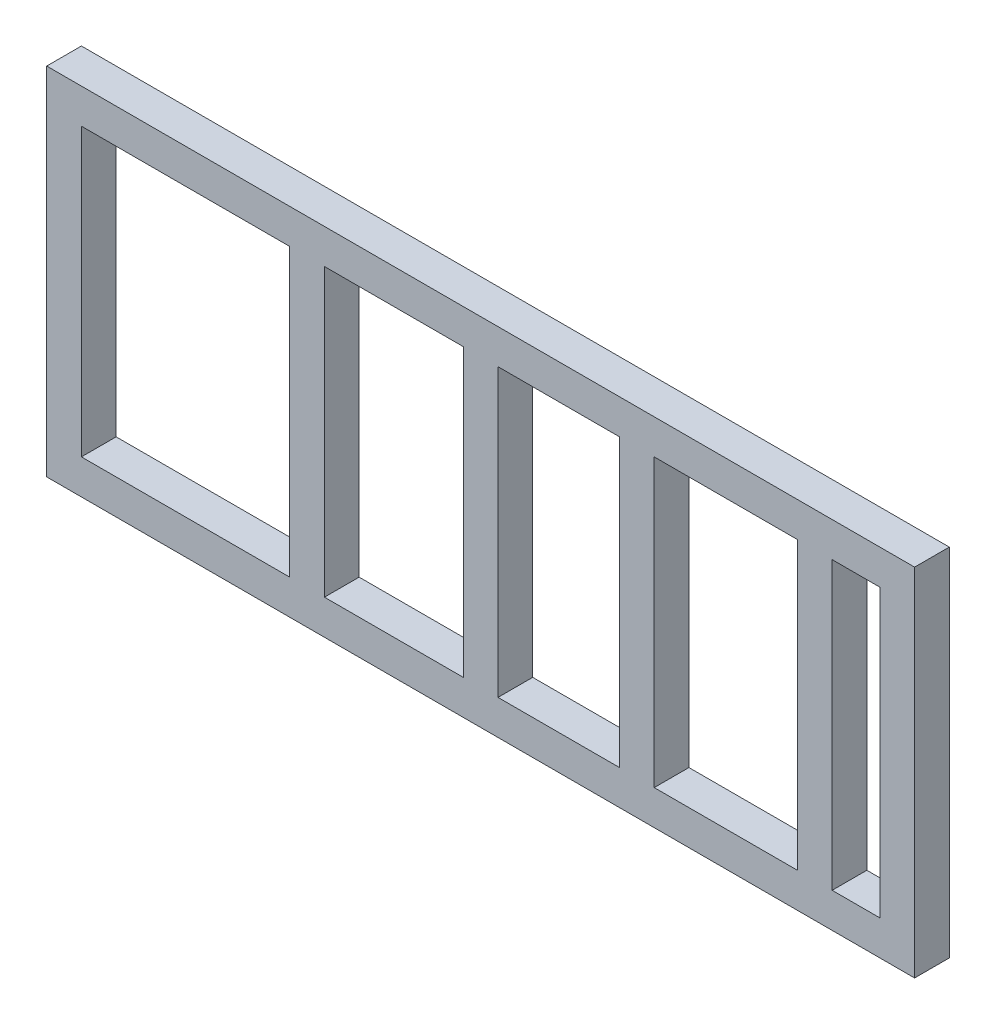
ISO-10303-21;
HEADER;
FILE_DESCRIPTION(('STEP AP214'),'2;1');
FILE_NAME('part.step','',(''),(''),'','','');
FILE_SCHEMA(('AUTOMOTIVE_DESIGN { 1 0 10303 214 1 1 1 1 }'));
ENDSEC;
DATA;
#1=APPLICATION_CONTEXT('core data for automotive mechanical design processes');
#2=APPLICATION_PROTOCOL_DEFINITION('international standard','automotive_design',2000,#1);
#3=PRODUCT_CONTEXT('',#1,'mechanical');
#4=PRODUCT('Part','Part','',(#3));
#5=PRODUCT_RELATED_PRODUCT_CATEGORY('part','',(#4));
#6=PRODUCT_DEFINITION_FORMATION('','',#4);
#7=PRODUCT_DEFINITION_CONTEXT('part definition',#1,'design');
#8=PRODUCT_DEFINITION('design','',#6,#7);
#9=PRODUCT_DEFINITION_SHAPE('','',#8);
#10=(LENGTH_UNIT() NAMED_UNIT(*) SI_UNIT(.MILLI.,.METRE.));
#11=(NAMED_UNIT(*) PLANE_ANGLE_UNIT() SI_UNIT($,.RADIAN.));
#12=(NAMED_UNIT(*) SI_UNIT($,.STERADIAN.) SOLID_ANGLE_UNIT());
#13=UNCERTAINTY_MEASURE_WITH_UNIT(LENGTH_MEASURE(1.E-05),#10,'distance_accuracy_value','');
#14=(GEOMETRIC_REPRESENTATION_CONTEXT(3) GLOBAL_UNCERTAINTY_ASSIGNED_CONTEXT((#13)) GLOBAL_UNIT_ASSIGNED_CONTEXT((#10,
#11,#12)) REPRESENTATION_CONTEXT('',''));
#15=CARTESIAN_POINT('',(0.,0.,0.));
#16=DIRECTION('',(0.,0.,1.));
#17=DIRECTION('',(1.,0.,0.));
#18=AXIS2_PLACEMENT_3D('',#15,#16,#17);
#19=CARTESIAN_POINT('',(405.,-165.,-45.));
#20=DIRECTION('',(1.,0.,0.));
#21=DIRECTION('',(0.,1.,0.));
#22=AXIS2_PLACEMENT_3D('',#19,#20,#21);
#23=PLANE('',#22);
#24=DIRECTION('',(0.,0.,1.));
#25=VECTOR('',#24,1.);
#26=CARTESIAN_POINT('',(405.,-165.,-45.));
#27=LINE('',#26,#25);
#28=CARTESIAN_POINT('',(405.,-165.,-45.));
#29=VERTEX_POINT('',#28);
#30=CARTESIAN_POINT('',(405.,-165.,-5.));
#31=VERTEX_POINT('',#30);
#32=EDGE_CURVE('E464',#29,#31,#27,.T.);
#33=ORIENTED_EDGE('',*,*,#32,.F.);
#34=DIRECTION('',(0.,1.,0.));
#35=VECTOR('',#34,1.);
#36=CARTESIAN_POINT('',(405.,-165.,-45.));
#37=LINE('',#36,#35);
#38=CARTESIAN_POINT('',(405.,165.,-45.));
#39=VERTEX_POINT('',#38);
#40=EDGE_CURVE('E303',#29,#39,#37,.T.);
#41=ORIENTED_EDGE('',*,*,#40,.T.);
#42=DIRECTION('',(0.,0.,1.));
#43=VECTOR('',#42,1.);
#44=CARTESIAN_POINT('',(405.,165.,-45.));
#45=LINE('',#44,#43);
#46=CARTESIAN_POINT('',(405.,165.,-5.));
#47=VERTEX_POINT('',#46);
#48=EDGE_CURVE('E429',#39,#47,#45,.T.);
#49=ORIENTED_EDGE('',*,*,#48,.T.);
#50=DIRECTION('',(0.,1.,0.));
#51=VECTOR('',#50,1.);
#52=CARTESIAN_POINT('',(405.,-165.,-5.));
#53=LINE('',#52,#51);
#54=EDGE_CURVE('E309',#31,#47,#53,.T.);
#55=ORIENTED_EDGE('',*,*,#54,.F.);
#56=EDGE_LOOP('',(#33,#41,#49,#55));
#57=FACE_BOUND('',#56,.T.);
#58=ADVANCED_FACE('F15',(#57),#23,.T.);
#59=CARTESIAN_POINT('',(365.,-165.,-45.));
#60=DIRECTION('',(1.,0.,0.));
#61=DIRECTION('',(0.,1.,0.));
#62=AXIS2_PLACEMENT_3D('',#59,#60,#61);
#63=PLANE('',#62);
#64=DIRECTION('',(0.,1.,0.));
#65=VECTOR('',#64,1.);
#66=CARTESIAN_POINT('',(365.,-165.,-5.));
#67=LINE('',#66,#65);
#68=CARTESIAN_POINT('',(365.,-165.,-5.));
#69=VERTEX_POINT('',#68);
#70=CARTESIAN_POINT('',(365.,165.,-5.));
#71=VERTEX_POINT('',#70);
#72=EDGE_CURVE('E274',#69,#71,#67,.T.);
#73=ORIENTED_EDGE('',*,*,#72,.T.);
#74=DIRECTION('',(0.,0.,1.));
#75=VECTOR('',#74,1.);
#76=CARTESIAN_POINT('',(365.,165.,-45.));
#77=LINE('',#76,#75);
#78=CARTESIAN_POINT('',(365.,165.,-45.));
#79=VERTEX_POINT('',#78);
#80=EDGE_CURVE('E433',#79,#71,#77,.T.);
#81=ORIENTED_EDGE('',*,*,#80,.F.);
#82=DIRECTION('',(0.,1.,0.));
#83=VECTOR('',#82,1.);
#84=CARTESIAN_POINT('',(365.,-165.,-45.));
#85=LINE('',#84,#83);
#86=CARTESIAN_POINT('',(365.,-165.,-45.));
#87=VERTEX_POINT('',#86);
#88=EDGE_CURVE('E427',#87,#79,#85,.T.);
#89=ORIENTED_EDGE('',*,*,#88,.F.);
#90=DIRECTION('',(0.,0.,1.));
#91=VECTOR('',#90,1.);
#92=CARTESIAN_POINT('',(365.,-165.,-45.));
#93=LINE('',#92,#91);
#94=EDGE_CURVE('E292',#87,#69,#93,.T.);
#95=ORIENTED_EDGE('',*,*,#94,.T.);
#96=EDGE_LOOP('',(#73,#81,#89,#95));
#97=FACE_BOUND('',#96,.T.);
#98=ADVANCED_FACE('F532',(#97),#63,.F.);
#99=CARTESIAN_POINT('',(-220.,-165.,-45.));
#100=DIRECTION('',(1.,0.,0.));
#101=DIRECTION('',(0.,1.,0.));
#102=AXIS2_PLACEMENT_3D('',#99,#100,#101);
#103=PLANE('',#102);
#104=DIRECTION('',(0.,1.,0.));
#105=VECTOR('',#104,1.);
#106=CARTESIAN_POINT('',(-220.,-165.,-5.));
#107=LINE('',#106,#105);
#108=CARTESIAN_POINT('',(-220.,-165.,-5.));
#109=VERTEX_POINT('',#108);
#110=CARTESIAN_POINT('',(-220.,165.,-5.));
#111=VERTEX_POINT('',#110);
#112=EDGE_CURVE('E239',#109,#111,#107,.T.);
#113=ORIENTED_EDGE('',*,*,#112,.T.);
#114=DIRECTION('',(0.,0.,1.));
#115=VECTOR('',#114,1.);
#116=CARTESIAN_POINT('',(-220.,165.,-45.));
#117=LINE('',#116,#115);
#118=CARTESIAN_POINT('',(-220.,165.,-45.));
#119=VERTEX_POINT('',#118);
#120=EDGE_CURVE('E9',#119,#111,#117,.T.);
#121=ORIENTED_EDGE('',*,*,#120,.F.);
#122=DIRECTION('',(0.,1.,0.));
#123=VECTOR('',#122,1.);
#124=CARTESIAN_POINT('',(-220.,-165.,-45.));
#125=LINE('',#124,#123);
#126=CARTESIAN_POINT('',(-220.,-165.,-45.));
#127=VERTEX_POINT('',#126);
#128=EDGE_CURVE('E414',#127,#119,#125,.T.);
#129=ORIENTED_EDGE('',*,*,#128,.F.);
#130=DIRECTION('',(0.,0.,1.));
#131=VECTOR('',#130,1.);
#132=CARTESIAN_POINT('',(-220.,-165.,-45.));
#133=LINE('',#132,#131);
#134=EDGE_CURVE('E489',#127,#109,#133,.T.);
#135=ORIENTED_EDGE('',*,*,#134,.T.);
#136=EDGE_LOOP('',(#113,#121,#129,#135));
#137=FACE_BOUND('',#136,.T.);
#138=ADVANCED_FACE('F539',(#137),#103,.F.);
#139=CARTESIAN_POINT('',(-460.,165.,-45.));
#140=DIRECTION('',(0.,1.,0.));
#141=DIRECTION('',(1.,0.,0.));
#142=AXIS2_PLACEMENT_3D('',#139,#140,#141);
#143=PLANE('',#142);
#144=ORIENTED_EDGE('',*,*,#120,.T.);
#145=DIRECTION('',(1.,0.,0.));
#146=VECTOR('',#145,1.);
#147=CARTESIAN_POINT('',(-460.,165.,-5.));
#148=LINE('',#147,#146);
#149=CARTESIAN_POINT('',(-460.,165.,-5.));
#150=VERTEX_POINT('',#149);
#151=EDGE_CURVE('E374',#150,#111,#148,.T.);
#152=ORIENTED_EDGE('',*,*,#151,.F.);
#153=DIRECTION('',(0.,0.,1.));
#154=VECTOR('',#153,1.);
#155=CARTESIAN_POINT('',(-460.,165.,-45.));
#156=LINE('',#155,#154);
#157=CARTESIAN_POINT('',(-460.,165.,-45.));
#158=VERTEX_POINT('',#157);
#159=EDGE_CURVE('E23',#158,#150,#156,.T.);
#160=ORIENTED_EDGE('',*,*,#159,.F.);
#161=DIRECTION('',(1.,0.,0.));
#162=VECTOR('',#161,1.);
#163=CARTESIAN_POINT('',(-460.,165.,-45.));
#164=LINE('',#163,#162);
#165=EDGE_CURVE('E460',#158,#119,#164,.T.);
#166=ORIENTED_EDGE('',*,*,#165,.T.);
#167=EDGE_LOOP('',(#144,#152,#160,#166));
#168=FACE_BOUND('',#167,.T.);
#169=ADVANCED_FACE('F499',(#168),#143,.F.);
#170=CARTESIAN_POINT('',(-460.,-205.,-45.));
#171=DIRECTION('',(1.,0.,0.));
#172=DIRECTION('',(0.,1.,0.));
#173=AXIS2_PLACEMENT_3D('',#170,#171,#172);
#174=PLANE('',#173);
#175=DIRECTION('',(0.,1.,0.));
#176=VECTOR('',#175,1.);
#177=CARTESIAN_POINT('',(-460.,-205.,-5.));
#178=LINE('',#177,#176);
#179=CARTESIAN_POINT('',(-460.,-165.,-5.));
#180=VERTEX_POINT('',#179);
#181=EDGE_CURVE('E377',#180,#150,#178,.T.);
#182=ORIENTED_EDGE('',*,*,#181,.F.);
#183=DIRECTION('',(0.,0.,1.));
#184=VECTOR('',#183,1.);
#185=CARTESIAN_POINT('',(-460.,-165.,-45.));
#186=LINE('',#185,#184);
#187=CARTESIAN_POINT('',(-460.,-165.,-45.));
#188=VERTEX_POINT('',#187);
#189=EDGE_CURVE('E34',#188,#180,#186,.T.);
#190=ORIENTED_EDGE('',*,*,#189,.F.);
#191=DIRECTION('',(0.,1.,0.));
#192=VECTOR('',#191,1.);
#193=CARTESIAN_POINT('',(-460.,-205.,-45.));
#194=LINE('',#193,#192);
#195=EDGE_CURVE('E422',#188,#158,#194,.T.);
#196=ORIENTED_EDGE('',*,*,#195,.T.);
#197=ORIENTED_EDGE('',*,*,#159,.T.);
#198=EDGE_LOOP('',(#182,#190,#196,#197));
#199=FACE_BOUND('',#198,.T.);
#200=ADVANCED_FACE('F493',(#199),#174,.T.);
#201=CARTESIAN_POINT('',(-460.,-165.,-45.));
#202=DIRECTION('',(0.,1.,0.));
#203=DIRECTION('',(1.,0.,0.));
#204=AXIS2_PLACEMENT_3D('',#201,#202,#203);
#205=PLANE('',#204);
#206=DIRECTION('',(1.,0.,0.));
#207=VECTOR('',#206,1.);
#208=CARTESIAN_POINT('',(-460.,-165.,-45.));
#209=LINE('',#208,#207);
#210=EDGE_CURVE('E423',#188,#127,#209,.T.);
#211=ORIENTED_EDGE('',*,*,#210,.F.);
#212=ORIENTED_EDGE('',*,*,#189,.T.);
#213=DIRECTION('',(1.,0.,0.));
#214=VECTOR('',#213,1.);
#215=CARTESIAN_POINT('',(-460.,-165.,-5.));
#216=LINE('',#215,#214);
#217=EDGE_CURVE('E382',#180,#109,#216,.T.);
#218=ORIENTED_EDGE('',*,*,#217,.T.);
#219=ORIENTED_EDGE('',*,*,#134,.F.);
#220=EDGE_LOOP('',(#211,#212,#218,#219));
#221=FACE_BOUND('',#220,.T.);
#222=ADVANCED_FACE('F504',(#221),#205,.T.);
#223=CARTESIAN_POINT('',(-20.,-165.,-45.));
#224=DIRECTION('',(1.,0.,0.));
#225=DIRECTION('',(0.,1.,0.));
#226=AXIS2_PLACEMENT_3D('',#223,#224,#225);
#227=PLANE('',#226);
#228=DIRECTION('',(0.,1.,0.));
#229=VECTOR('',#228,1.);
#230=CARTESIAN_POINT('',(-20.,-165.,-5.));
#231=LINE('',#230,#229);
#232=CARTESIAN_POINT('',(-20.,-165.,-5.));
#233=VERTEX_POINT('',#232);
#234=CARTESIAN_POINT('',(-20.,165.,-5.));
#235=VERTEX_POINT('',#234);
#236=EDGE_CURVE('E372',#233,#235,#231,.T.);
#237=ORIENTED_EDGE('',*,*,#236,.T.);
#238=DIRECTION('',(0.,0.,1.));
#239=VECTOR('',#238,1.);
#240=CARTESIAN_POINT('',(-20.,165.,-45.));
#241=LINE('',#240,#239);
#242=CARTESIAN_POINT('',(-20.,165.,-45.));
#243=VERTEX_POINT('',#242);
#244=EDGE_CURVE('E332',#243,#235,#241,.T.);
#245=ORIENTED_EDGE('',*,*,#244,.F.);
#246=DIRECTION('',(0.,1.,0.));
#247=VECTOR('',#246,1.);
#248=CARTESIAN_POINT('',(-20.,-165.,-45.));
#249=LINE('',#248,#247);
#250=CARTESIAN_POINT('',(-20.,-165.,-45.));
#251=VERTEX_POINT('',#250);
#252=EDGE_CURVE('E396',#251,#243,#249,.T.);
#253=ORIENTED_EDGE('',*,*,#252,.F.);
#254=DIRECTION('',(0.,0.,1.));
#255=VECTOR('',#254,1.);
#256=CARTESIAN_POINT('',(-20.,-165.,-45.));
#257=LINE('',#256,#255);
#258=EDGE_CURVE('E483',#251,#233,#257,.T.);
#259=ORIENTED_EDGE('',*,*,#258,.T.);
#260=EDGE_LOOP('',(#237,#245,#253,#259));
#261=FACE_BOUND('',#260,.T.);
#262=ADVANCED_FACE('F598',(#261),#227,.F.);
#263=CARTESIAN_POINT('',(-460.,165.,-45.));
#264=DIRECTION('',(0.,1.,0.));
#265=DIRECTION('',(1.,0.,0.));
#266=AXIS2_PLACEMENT_3D('',#263,#264,#265);
#267=PLANE('',#266);
#268=ORIENTED_EDGE('',*,*,#244,.T.);
#269=DIRECTION('',(1.,0.,0.));
#270=VECTOR('',#269,1.);
#271=CARTESIAN_POINT('',(-460.,165.,-5.));
#272=LINE('',#271,#270);
#273=CARTESIAN_POINT('',(-180.,165.,-5.));
#274=VERTEX_POINT('',#273);
#275=EDGE_CURVE('E367',#274,#235,#272,.T.);
#276=ORIENTED_EDGE('',*,*,#275,.F.);
#277=DIRECTION('',(0.,0.,1.));
#278=VECTOR('',#277,1.);
#279=CARTESIAN_POINT('',(-180.,165.,-45.));
#280=LINE('',#279,#278);
#281=CARTESIAN_POINT('',(-180.,165.,-45.));
#282=VERTEX_POINT('',#281);
#283=EDGE_CURVE('E331',#282,#274,#280,.T.);
#284=ORIENTED_EDGE('',*,*,#283,.F.);
#285=DIRECTION('',(1.,0.,0.));
#286=VECTOR('',#285,1.);
#287=CARTESIAN_POINT('',(-460.,165.,-45.));
#288=LINE('',#287,#286);
#289=EDGE_CURVE('E397',#282,#243,#288,.T.);
#290=ORIENTED_EDGE('',*,*,#289,.T.);
#291=EDGE_LOOP('',(#268,#276,#284,#290));
#292=FACE_BOUND('',#291,.T.);
#293=ADVANCED_FACE('F592',(#292),#267,.F.);
#294=CARTESIAN_POINT('',(-180.,-165.,-45.));
#295=DIRECTION('',(1.,0.,0.));
#296=DIRECTION('',(0.,1.,0.));
#297=AXIS2_PLACEMENT_3D('',#294,#295,#296);
#298=PLANE('',#297);
#299=DIRECTION('',(0.,0.,1.));
#300=VECTOR('',#299,1.);
#301=CARTESIAN_POINT('',(-180.,-165.,-45.));
#302=LINE('',#301,#300);
#303=CARTESIAN_POINT('',(-180.,-165.,-45.));
#304=VERTEX_POINT('',#303);
#305=CARTESIAN_POINT('',(-180.,-165.,-5.));
#306=VERTEX_POINT('',#305);
#307=EDGE_CURVE('E477',#304,#306,#302,.T.);
#308=ORIENTED_EDGE('',*,*,#307,.F.);
#309=DIRECTION('',(0.,1.,0.));
#310=VECTOR('',#309,1.);
#311=CARTESIAN_POINT('',(-180.,-165.,-45.));
#312=LINE('',#311,#310);
#313=EDGE_CURVE('E418',#304,#282,#312,.T.);
#314=ORIENTED_EDGE('',*,*,#313,.T.);
#315=ORIENTED_EDGE('',*,*,#283,.T.);
#316=DIRECTION('',(0.,1.,0.));
#317=VECTOR('',#316,1.);
#318=CARTESIAN_POINT('',(-180.,-165.,-5.));
#319=LINE('',#318,#317);
#320=EDGE_CURVE('E368',#306,#274,#319,.T.);
#321=ORIENTED_EDGE('',*,*,#320,.F.);
#322=EDGE_LOOP('',(#308,#314,#315,#321));
#323=FACE_BOUND('',#322,.T.);
#324=ADVANCED_FACE('F587',(#323),#298,.T.);
#325=CARTESIAN_POINT('',(-460.,-165.,-45.));
#326=DIRECTION('',(0.,1.,0.));
#327=DIRECTION('',(1.,0.,0.));
#328=AXIS2_PLACEMENT_3D('',#325,#326,#327);
#329=PLANE('',#328);
#330=DIRECTION('',(1.,0.,0.));
#331=VECTOR('',#330,1.);
#332=CARTESIAN_POINT('',(-460.,-165.,-45.));
#333=LINE('',#332,#331);
#334=EDGE_CURVE('E411',#304,#251,#333,.T.);
#335=ORIENTED_EDGE('',*,*,#334,.F.);
#336=ORIENTED_EDGE('',*,*,#307,.T.);
#337=DIRECTION('',(1.,0.,0.));
#338=VECTOR('',#337,1.);
#339=CARTESIAN_POINT('',(-460.,-165.,-5.));
#340=LINE('',#339,#338);
#341=EDGE_CURVE('E362',#306,#233,#340,.T.);
#342=ORIENTED_EDGE('',*,*,#341,.T.);
#343=ORIENTED_EDGE('',*,*,#258,.F.);
#344=EDGE_LOOP('',(#335,#336,#342,#343));
#345=FACE_BOUND('',#344,.T.);
#346=ADVANCED_FACE('F590',(#345),#329,.T.);
#347=CARTESIAN_POINT('',(160.,-165.,-45.));
#348=DIRECTION('',(1.,0.,0.));
#349=DIRECTION('',(0.,1.,0.));
#350=AXIS2_PLACEMENT_3D('',#347,#348,#349);
#351=PLANE('',#350);
#352=DIRECTION('',(0.,1.,0.));
#353=VECTOR('',#352,1.);
#354=CARTESIAN_POINT('',(160.,-165.,-5.));
#355=LINE('',#354,#353);
#356=CARTESIAN_POINT('',(160.,-165.,-5.));
#357=VERTEX_POINT('',#356);
#358=CARTESIAN_POINT('',(160.,165.,-5.));
#359=VERTEX_POINT('',#358);
#360=EDGE_CURVE('E358',#357,#359,#355,.T.);
#361=ORIENTED_EDGE('',*,*,#360,.T.);
#362=DIRECTION('',(0.,0.,1.));
#363=VECTOR('',#362,1.);
#364=CARTESIAN_POINT('',(160.,165.,-45.));
#365=LINE('',#364,#363);
#366=CARTESIAN_POINT('',(160.,165.,-45.));
#367=VERTEX_POINT('',#366);
#368=EDGE_CURVE('E480',#367,#359,#365,.T.);
#369=ORIENTED_EDGE('',*,*,#368,.F.);
#370=DIRECTION('',(0.,1.,0.));
#371=VECTOR('',#370,1.);
#372=CARTESIAN_POINT('',(160.,-165.,-45.));
#373=LINE('',#372,#371);
#374=CARTESIAN_POINT('',(160.,-165.,-45.));
#375=VERTEX_POINT('',#374);
#376=EDGE_CURVE('E282',#375,#367,#373,.T.);
#377=ORIENTED_EDGE('',*,*,#376,.F.);
#378=DIRECTION('',(0.,0.,1.));
#379=VECTOR('',#378,1.);
#380=CARTESIAN_POINT('',(160.,-165.,-45.));
#381=LINE('',#380,#379);
#382=EDGE_CURVE('E304',#375,#357,#381,.T.);
#383=ORIENTED_EDGE('',*,*,#382,.T.);
#384=EDGE_LOOP('',(#361,#369,#377,#383));
#385=FACE_BOUND('',#384,.T.);
#386=ADVANCED_FACE('F571',(#385),#351,.F.);
#387=CARTESIAN_POINT('',(-460.,165.,-45.));
#388=DIRECTION('',(0.,1.,0.));
#389=DIRECTION('',(1.,0.,0.));
#390=AXIS2_PLACEMENT_3D('',#387,#388,#389);
#391=PLANE('',#390);
#392=ORIENTED_EDGE('',*,*,#368,.T.);
#393=DIRECTION('',(1.,0.,0.));
#394=VECTOR('',#393,1.);
#395=CARTESIAN_POINT('',(-460.,165.,-5.));
#396=LINE('',#395,#394);
#397=CARTESIAN_POINT('',(20.,165.,-5.));
#398=VERTEX_POINT('',#397);
#399=EDGE_CURVE('E353',#398,#359,#396,.T.);
#400=ORIENTED_EDGE('',*,*,#399,.F.);
#401=DIRECTION('',(0.,0.,1.));
#402=VECTOR('',#401,1.);
#403=CARTESIAN_POINT('',(20.,165.,-45.));
#404=LINE('',#403,#402);
#405=CARTESIAN_POINT('',(20.,165.,-45.));
#406=VERTEX_POINT('',#405);
#407=EDGE_CURVE('E306',#406,#398,#404,.T.);
#408=ORIENTED_EDGE('',*,*,#407,.F.);
#409=DIRECTION('',(1.,0.,0.));
#410=VECTOR('',#409,1.);
#411=CARTESIAN_POINT('',(-460.,165.,-45.));
#412=LINE('',#411,#410);
#413=EDGE_CURVE('E280',#406,#367,#412,.T.);
#414=ORIENTED_EDGE('',*,*,#413,.T.);
#415=EDGE_LOOP('',(#392,#400,#408,#414));
#416=FACE_BOUND('',#415,.T.);
#417=ADVANCED_FACE('F566',(#416),#391,.F.);
#418=CARTESIAN_POINT('',(20.,-165.,-45.));
#419=DIRECTION('',(1.,0.,0.));
#420=DIRECTION('',(0.,1.,0.));
#421=AXIS2_PLACEMENT_3D('',#418,#419,#420);
#422=PLANE('',#421);
#423=DIRECTION('',(0.,0.,1.));
#424=VECTOR('',#423,1.);
#425=CARTESIAN_POINT('',(20.,-165.,-45.));
#426=LINE('',#425,#424);
#427=CARTESIAN_POINT('',(20.,-165.,-45.));
#428=VERTEX_POINT('',#427);
#429=CARTESIAN_POINT('',(20.,-165.,-5.));
#430=VERTEX_POINT('',#429);
#431=EDGE_CURVE('E310',#428,#430,#426,.T.);
#432=ORIENTED_EDGE('',*,*,#431,.F.);
#433=DIRECTION('',(0.,1.,0.));
#434=VECTOR('',#433,1.);
#435=CARTESIAN_POINT('',(20.,-165.,-45.));
#436=LINE('',#435,#434);
#437=EDGE_CURVE('E281',#428,#406,#436,.T.);
#438=ORIENTED_EDGE('',*,*,#437,.T.);
#439=ORIENTED_EDGE('',*,*,#407,.T.);
#440=DIRECTION('',(0.,1.,0.));
#441=VECTOR('',#440,1.);
#442=CARTESIAN_POINT('',(20.,-165.,-5.));
#443=LINE('',#442,#441);
#444=EDGE_CURVE('E344',#430,#398,#443,.T.);
#445=ORIENTED_EDGE('',*,*,#444,.F.);
#446=EDGE_LOOP('',(#432,#438,#439,#445));
#447=FACE_BOUND('',#446,.T.);
#448=ADVANCED_FACE('F569',(#447),#422,.T.);
#449=CARTESIAN_POINT('',(-460.,-165.,-45.));
#450=DIRECTION('',(0.,1.,0.));
#451=DIRECTION('',(1.,0.,0.));
#452=AXIS2_PLACEMENT_3D('',#449,#450,#451);
#453=PLANE('',#452);
#454=DIRECTION('',(1.,0.,0.));
#455=VECTOR('',#454,1.);
#456=CARTESIAN_POINT('',(-460.,-165.,-45.));
#457=LINE('',#456,#455);
#458=EDGE_CURVE('E399',#428,#375,#457,.T.);
#459=ORIENTED_EDGE('',*,*,#458,.F.);
#460=ORIENTED_EDGE('',*,*,#431,.T.);
#461=DIRECTION('',(1.,0.,0.));
#462=VECTOR('',#461,1.);
#463=CARTESIAN_POINT('',(-460.,-165.,-5.));
#464=LINE('',#463,#462);
#465=EDGE_CURVE('E341',#430,#357,#464,.T.);
#466=ORIENTED_EDGE('',*,*,#465,.T.);
#467=ORIENTED_EDGE('',*,*,#382,.F.);
#468=EDGE_LOOP('',(#459,#460,#466,#467));
#469=FACE_BOUND('',#468,.T.);
#470=ADVANCED_FACE('F579',(#469),#453,.T.);
#471=CARTESIAN_POINT('',(-460.,165.,-45.));
#472=DIRECTION('',(0.,1.,0.));
#473=DIRECTION('',(1.,0.,0.));
#474=AXIS2_PLACEMENT_3D('',#471,#472,#473);
#475=PLANE('',#474);
#476=DIRECTION('',(0.,0.,1.));
#477=VECTOR('',#476,1.);
#478=CARTESIAN_POINT('',(460.,165.,-45.));
#479=LINE('',#478,#477);
#480=CARTESIAN_POINT('',(460.,165.,-45.));
#481=VERTEX_POINT('',#480);
#482=CARTESIAN_POINT('',(460.,165.,-5.));
#483=VERTEX_POINT('',#482);
#484=EDGE_CURVE('E387',#481,#483,#479,.T.);
#485=ORIENTED_EDGE('',*,*,#484,.T.);
#486=DIRECTION('',(1.,0.,0.));
#487=VECTOR('',#486,1.);
#488=CARTESIAN_POINT('',(-460.,165.,-5.));
#489=LINE('',#488,#487);
#490=EDGE_CURVE('E314',#47,#483,#489,.T.);
#491=ORIENTED_EDGE('',*,*,#490,.F.);
#492=ORIENTED_EDGE('',*,*,#48,.F.);
#493=DIRECTION('',(1.,0.,0.));
#494=VECTOR('',#493,1.);
#495=CARTESIAN_POINT('',(-460.,165.,-45.));
#496=LINE('',#495,#494);
#497=EDGE_CURVE('E299',#39,#481,#496,.T.);
#498=ORIENTED_EDGE('',*,*,#497,.T.);
#499=EDGE_LOOP('',(#485,#491,#492,#498));
#500=FACE_BOUND('',#499,.T.);
#501=ADVANCED_FACE('F555',(#500),#475,.F.);
#502=CARTESIAN_POINT('',(-460.,165.,-45.));
#503=DIRECTION('',(0.,1.,0.));
#504=DIRECTION('',(1.,0.,0.));
#505=AXIS2_PLACEMENT_3D('',#502,#503,#504);
#506=PLANE('',#505);
#507=ORIENTED_EDGE('',*,*,#80,.T.);
#508=DIRECTION('',(1.,0.,0.));
#509=VECTOR('',#508,1.);
#510=CARTESIAN_POINT('',(-460.,165.,-5.));
#511=LINE('',#510,#509);
#512=CARTESIAN_POINT('',(200.,165.,-5.));
#513=VERTEX_POINT('',#512);
#514=EDGE_CURVE('E271',#513,#71,#511,.T.);
#515=ORIENTED_EDGE('',*,*,#514,.F.);
#516=DIRECTION('',(0.,0.,1.));
#517=VECTOR('',#516,1.);
#518=CARTESIAN_POINT('',(200.,165.,-45.));
#519=LINE('',#518,#517);
#520=CARTESIAN_POINT('',(200.,165.,-45.));
#521=VERTEX_POINT('',#520);
#522=EDGE_CURVE('E468',#521,#513,#519,.T.);
#523=ORIENTED_EDGE('',*,*,#522,.F.);
#524=DIRECTION('',(1.,0.,0.));
#525=VECTOR('',#524,1.);
#526=CARTESIAN_POINT('',(-460.,165.,-45.));
#527=LINE('',#526,#525);
#528=EDGE_CURVE('E440',#521,#79,#527,.T.);
#529=ORIENTED_EDGE('',*,*,#528,.T.);
#530=EDGE_LOOP('',(#507,#515,#523,#529));
#531=FACE_BOUND('',#530,.T.);
#532=ADVANCED_FACE('F576',(#531),#506,.F.);
#533=CARTESIAN_POINT('',(200.,-165.,-45.));
#534=DIRECTION('',(1.,0.,0.));
#535=DIRECTION('',(0.,1.,0.));
#536=AXIS2_PLACEMENT_3D('',#533,#534,#535);
#537=PLANE('',#536);
#538=DIRECTION('',(0.,0.,1.));
#539=VECTOR('',#538,1.);
#540=CARTESIAN_POINT('',(200.,-165.,-45.));
#541=LINE('',#540,#539);
#542=CARTESIAN_POINT('',(200.,-165.,-45.));
#543=VERTEX_POINT('',#542);
#544=CARTESIAN_POINT('',(200.,-165.,-5.));
#545=VERTEX_POINT('',#544);
#546=EDGE_CURVE('E295',#543,#545,#541,.T.);
#547=ORIENTED_EDGE('',*,*,#546,.F.);
#548=DIRECTION('',(0.,1.,0.));
#549=VECTOR('',#548,1.);
#550=CARTESIAN_POINT('',(200.,-165.,-45.));
#551=LINE('',#550,#549);
#552=EDGE_CURVE('E349',#543,#521,#551,.T.);
#553=ORIENTED_EDGE('',*,*,#552,.T.);
#554=ORIENTED_EDGE('',*,*,#522,.T.);
#555=DIRECTION('',(0.,1.,0.));
#556=VECTOR('',#555,1.);
#557=CARTESIAN_POINT('',(200.,-165.,-5.));
#558=LINE('',#557,#556);
#559=EDGE_CURVE('E277',#545,#513,#558,.T.);
#560=ORIENTED_EDGE('',*,*,#559,.F.);
#561=EDGE_LOOP('',(#547,#553,#554,#560));
#562=FACE_BOUND('',#561,.T.);
#563=ADVANCED_FACE('F574',(#562),#537,.T.);
#564=CARTESIAN_POINT('',(-460.,-165.,-45.));
#565=DIRECTION('',(0.,1.,0.));
#566=DIRECTION('',(1.,0.,0.));
#567=AXIS2_PLACEMENT_3D('',#564,#565,#566);
#568=PLANE('',#567);
#569=DIRECTION('',(1.,0.,0.));
#570=VECTOR('',#569,1.);
#571=CARTESIAN_POINT('',(-460.,-165.,-45.));
#572=LINE('',#571,#570);
#573=CARTESIAN_POINT('',(460.,-165.,-45.));
#574=VERTEX_POINT('',#573);
#575=EDGE_CURVE('E409',#29,#574,#572,.T.);
#576=ORIENTED_EDGE('',*,*,#575,.F.);
#577=ORIENTED_EDGE('',*,*,#32,.T.);
#578=DIRECTION('',(1.,0.,0.));
#579=VECTOR('',#578,1.);
#580=CARTESIAN_POINT('',(-460.,-165.,-5.));
#581=LINE('',#580,#579);
#582=CARTESIAN_POINT('',(460.,-165.,-5.));
#583=VERTEX_POINT('',#582);
#584=EDGE_CURVE('E312',#31,#583,#581,.T.);
#585=ORIENTED_EDGE('',*,*,#584,.T.);
#586=DIRECTION('',(0.,0.,1.));
#587=VECTOR('',#586,1.);
#588=CARTESIAN_POINT('',(460.,-165.,-45.));
#589=LINE('',#588,#587);
#590=EDGE_CURVE('E294',#574,#583,#589,.T.);
#591=ORIENTED_EDGE('',*,*,#590,.F.);
#592=EDGE_LOOP('',(#576,#577,#585,#591));
#593=FACE_BOUND('',#592,.T.);
#594=ADVANCED_FACE('F547',(#593),#568,.T.);
#595=CARTESIAN_POINT('',(-460.,-165.,-45.));
#596=DIRECTION('',(0.,1.,0.));
#597=DIRECTION('',(1.,0.,0.));
#598=AXIS2_PLACEMENT_3D('',#595,#596,#597);
#599=PLANE('',#598);
#600=DIRECTION('',(1.,0.,0.));
#601=VECTOR('',#600,1.);
#602=CARTESIAN_POINT('',(-460.,-165.,-45.));
#603=LINE('',#602,#601);
#604=EDGE_CURVE('E350',#543,#87,#603,.T.);
#605=ORIENTED_EDGE('',*,*,#604,.F.);
#606=ORIENTED_EDGE('',*,*,#546,.T.);
#607=DIRECTION('',(1.,0.,0.));
#608=VECTOR('',#607,1.);
#609=CARTESIAN_POINT('',(-460.,-165.,-5.));
#610=LINE('',#609,#608);
#611=EDGE_CURVE('E330',#545,#69,#610,.T.);
#612=ORIENTED_EDGE('',*,*,#611,.T.);
#613=ORIENTED_EDGE('',*,*,#94,.F.);
#614=EDGE_LOOP('',(#605,#606,#612,#613));
#615=FACE_BOUND('',#614,.T.);
#616=ADVANCED_FACE('F559',(#615),#599,.T.);
#617=CARTESIAN_POINT('',(460.,-205.,-45.));
#618=DIRECTION('',(1.,0.,0.));
#619=DIRECTION('',(0.,1.,0.));
#620=AXIS2_PLACEMENT_3D('',#617,#618,#619);
#621=PLANE('',#620);
#622=ORIENTED_EDGE('',*,*,#484,.F.);
#623=DIRECTION('',(0.,1.,0.));
#624=VECTOR('',#623,1.);
#625=CARTESIAN_POINT('',(460.,-205.,-45.));
#626=LINE('',#625,#624);
#627=EDGE_CURVE('E419',#574,#481,#626,.T.);
#628=ORIENTED_EDGE('',*,*,#627,.F.);
#629=ORIENTED_EDGE('',*,*,#590,.T.);
#630=DIRECTION('',(0.,1.,0.));
#631=VECTOR('',#630,1.);
#632=CARTESIAN_POINT('',(460.,-205.,-5.));
#633=LINE('',#632,#631);
#634=EDGE_CURVE('E253',#583,#483,#633,.T.);
#635=ORIENTED_EDGE('',*,*,#634,.T.);
#636=EDGE_LOOP('',(#622,#628,#629,#635));
#637=FACE_BOUND('',#636,.T.);
#638=ADVANCED_FACE('F529',(#637),#621,.F.);
#639=CARTESIAN_POINT('',(500.,-205.,-45.));
#640=DIRECTION('',(1.,0.,0.));
#641=DIRECTION('',(0.,1.,0.));
#642=AXIS2_PLACEMENT_3D('',#639,#640,#641);
#643=PLANE('',#642);
#644=DIRECTION('',(0.,0.,1.));
#645=VECTOR('',#644,1.);
#646=CARTESIAN_POINT('',(500.,-205.,-45.));
#647=LINE('',#646,#645);
#648=CARTESIAN_POINT('',(500.,-205.,-45.));
#649=VERTEX_POINT('',#648);
#650=CARTESIAN_POINT('',(500.,-205.,-5.));
#651=VERTEX_POINT('',#650);
#652=EDGE_CURVE('E289',#649,#651,#647,.T.);
#653=ORIENTED_EDGE('',*,*,#652,.F.);
#654=DIRECTION('',(0.,1.,0.));
#655=VECTOR('',#654,1.);
#656=CARTESIAN_POINT('',(500.,-205.,-45.));
#657=LINE('',#656,#655);
#658=CARTESIAN_POINT('',(500.,205.,-45.));
#659=VERTEX_POINT('',#658);
#660=EDGE_CURVE('E234',#649,#659,#657,.T.);
#661=ORIENTED_EDGE('',*,*,#660,.T.);
#662=DIRECTION('',(0.,0.,1.));
#663=VECTOR('',#662,1.);
#664=CARTESIAN_POINT('',(500.,205.,-45.));
#665=LINE('',#664,#663);
#666=CARTESIAN_POINT('',(500.,205.,-5.));
#667=VERTEX_POINT('',#666);
#668=EDGE_CURVE('E229',#659,#667,#665,.T.);
#669=ORIENTED_EDGE('',*,*,#668,.T.);
#670=DIRECTION('',(0.,1.,0.));
#671=VECTOR('',#670,1.);
#672=CARTESIAN_POINT('',(500.,-205.,-5.));
#673=LINE('',#672,#671);
#674=EDGE_CURVE('E233',#651,#667,#673,.T.);
#675=ORIENTED_EDGE('',*,*,#674,.F.);
#676=EDGE_LOOP('',(#653,#661,#669,#675));
#677=FACE_BOUND('',#676,.T.);
#678=ADVANCED_FACE('F231',(#677),#643,.T.);
#679=CARTESIAN_POINT('',(-500.,-205.,-45.));
#680=DIRECTION('',(0.,0.,1.));
#681=DIRECTION('',(1.,0.,0.));
#682=AXIS2_PLACEMENT_3D('',#679,#680,#681);
#683=PLANE('',#682);
#684=ORIENTED_EDGE('',*,*,#128,.T.);
#685=ORIENTED_EDGE('',*,*,#165,.F.);
#686=ORIENTED_EDGE('',*,*,#195,.F.);
#687=ORIENTED_EDGE('',*,*,#210,.T.);
#688=EDGE_LOOP('',(#684,#685,#686,#687));
#689=FACE_BOUND('',#688,.T.);
#690=ORIENTED_EDGE('',*,*,#252,.T.);
#691=ORIENTED_EDGE('',*,*,#289,.F.);
#692=ORIENTED_EDGE('',*,*,#313,.F.);
#693=ORIENTED_EDGE('',*,*,#334,.T.);
#694=EDGE_LOOP('',(#690,#691,#692,#693));
#695=FACE_BOUND('',#694,.T.);
#696=ORIENTED_EDGE('',*,*,#376,.T.);
#697=ORIENTED_EDGE('',*,*,#413,.F.);
#698=ORIENTED_EDGE('',*,*,#437,.F.);
#699=ORIENTED_EDGE('',*,*,#458,.T.);
#700=EDGE_LOOP('',(#696,#697,#698,#699));
#701=FACE_BOUND('',#700,.T.);
#702=ORIENTED_EDGE('',*,*,#88,.T.);
#703=ORIENTED_EDGE('',*,*,#528,.F.);
#704=ORIENTED_EDGE('',*,*,#552,.F.);
#705=ORIENTED_EDGE('',*,*,#604,.T.);
#706=EDGE_LOOP('',(#702,#703,#704,#705));
#707=FACE_BOUND('',#706,.T.);
#708=ORIENTED_EDGE('',*,*,#497,.F.);
#709=ORIENTED_EDGE('',*,*,#40,.F.);
#710=ORIENTED_EDGE('',*,*,#575,.T.);
#711=ORIENTED_EDGE('',*,*,#627,.T.);
#712=EDGE_LOOP('',(#708,#709,#710,#711));
#713=FACE_BOUND('',#712,.T.);
#714=DIRECTION('',(-1.,0.,0.));
#715=VECTOR('',#714,1.);
#716=CARTESIAN_POINT('',(500.,205.,-45.));
#717=LINE('',#716,#715);
#718=CARTESIAN_POINT('',(-500.,205.,-45.));
#719=VERTEX_POINT('',#718);
#720=EDGE_CURVE('E237',#659,#719,#717,.T.);
#721=ORIENTED_EDGE('',*,*,#720,.F.);
#722=ORIENTED_EDGE('',*,*,#660,.F.);
#723=DIRECTION('',(1.,0.,0.));
#724=VECTOR('',#723,1.);
#725=CARTESIAN_POINT('',(-500.,-205.,-45.));
#726=LINE('',#725,#724);
#727=CARTESIAN_POINT('',(-500.,-205.,-45.));
#728=VERTEX_POINT('',#727);
#729=EDGE_CURVE('E260',#728,#649,#726,.T.);
#730=ORIENTED_EDGE('',*,*,#729,.F.);
#731=DIRECTION('',(0.,1.,0.));
#732=VECTOR('',#731,1.);
#733=CARTESIAN_POINT('',(-500.,-205.,-45.));
#734=LINE('',#733,#732);
#735=EDGE_CURVE('E269',#728,#719,#734,.T.);
#736=ORIENTED_EDGE('',*,*,#735,.T.);
#737=EDGE_LOOP('',(#721,#722,#730,#736));
#738=FACE_BOUND('',#737,.T.);
#739=ADVANCED_FACE('F510',(#689,#695,#701,#707,#713,#738),#683,.F.);
#740=CARTESIAN_POINT('',(-500.,205.,-45.));
#741=DIRECTION('',(0.,1.,0.));
#742=DIRECTION('',(1.,0.,0.));
#743=AXIS2_PLACEMENT_3D('',#740,#741,#742);
#744=PLANE('',#743);
#745=DIRECTION('',(0.,0.,1.));
#746=VECTOR('',#745,1.);
#747=CARTESIAN_POINT('',(-500.,205.,-45.));
#748=LINE('',#747,#746);
#749=CARTESIAN_POINT('',(-500.,205.,-5.));
#750=VERTEX_POINT('',#749);
#751=EDGE_CURVE('E246',#719,#750,#748,.T.);
#752=ORIENTED_EDGE('',*,*,#751,.T.);
#753=DIRECTION('',(-1.,0.,0.));
#754=VECTOR('',#753,1.);
#755=CARTESIAN_POINT('',(500.,205.,-5.));
#756=LINE('',#755,#754);
#757=EDGE_CURVE('E242',#667,#750,#756,.T.);
#758=ORIENTED_EDGE('',*,*,#757,.F.);
#759=ORIENTED_EDGE('',*,*,#668,.F.);
#760=ORIENTED_EDGE('',*,*,#720,.T.);
#761=EDGE_LOOP('',(#752,#758,#759,#760));
#762=FACE_BOUND('',#761,.T.);
#763=ADVANCED_FACE('F243',(#762),#744,.T.);
#764=CARTESIAN_POINT('',(-500.,-205.,-5.));
#765=DIRECTION('',(0.,0.,1.));
#766=DIRECTION('',(1.,0.,0.));
#767=AXIS2_PLACEMENT_3D('',#764,#765,#766);
#768=PLANE('',#767);
#769=ORIENTED_EDGE('',*,*,#217,.F.);
#770=ORIENTED_EDGE('',*,*,#181,.T.);
#771=ORIENTED_EDGE('',*,*,#151,.T.);
#772=ORIENTED_EDGE('',*,*,#112,.F.);
#773=EDGE_LOOP('',(#769,#770,#771,#772));
#774=FACE_BOUND('',#773,.T.);
#775=ORIENTED_EDGE('',*,*,#341,.F.);
#776=ORIENTED_EDGE('',*,*,#320,.T.);
#777=ORIENTED_EDGE('',*,*,#275,.T.);
#778=ORIENTED_EDGE('',*,*,#236,.F.);
#779=EDGE_LOOP('',(#775,#776,#777,#778));
#780=FACE_BOUND('',#779,.T.);
#781=ORIENTED_EDGE('',*,*,#465,.F.);
#782=ORIENTED_EDGE('',*,*,#444,.T.);
#783=ORIENTED_EDGE('',*,*,#399,.T.);
#784=ORIENTED_EDGE('',*,*,#360,.F.);
#785=EDGE_LOOP('',(#781,#782,#783,#784));
#786=FACE_BOUND('',#785,.T.);
#787=ORIENTED_EDGE('',*,*,#611,.F.);
#788=ORIENTED_EDGE('',*,*,#559,.T.);
#789=ORIENTED_EDGE('',*,*,#514,.T.);
#790=ORIENTED_EDGE('',*,*,#72,.F.);
#791=EDGE_LOOP('',(#787,#788,#789,#790));
#792=FACE_BOUND('',#791,.T.);
#793=ORIENTED_EDGE('',*,*,#634,.F.);
#794=ORIENTED_EDGE('',*,*,#584,.F.);
#795=ORIENTED_EDGE('',*,*,#54,.T.);
#796=ORIENTED_EDGE('',*,*,#490,.T.);
#797=EDGE_LOOP('',(#793,#794,#795,#796));
#798=FACE_BOUND('',#797,.T.);
#799=DIRECTION('',(0.,1.,0.));
#800=VECTOR('',#799,1.);
#801=CARTESIAN_POINT('',(-500.,-205.,-5.));
#802=LINE('',#801,#800);
#803=CARTESIAN_POINT('',(-500.,-205.,-5.));
#804=VERTEX_POINT('',#803);
#805=EDGE_CURVE('E270',#804,#750,#802,.T.);
#806=ORIENTED_EDGE('',*,*,#805,.F.);
#807=DIRECTION('',(-1.,0.,0.));
#808=VECTOR('',#807,1.);
#809=CARTESIAN_POINT('',(500.,-205.,-5.));
#810=LINE('',#809,#808);
#811=EDGE_CURVE('E255',#651,#804,#810,.T.);
#812=ORIENTED_EDGE('',*,*,#811,.F.);
#813=ORIENTED_EDGE('',*,*,#674,.T.);
#814=ORIENTED_EDGE('',*,*,#757,.T.);
#815=EDGE_LOOP('',(#806,#812,#813,#814));
#816=FACE_BOUND('',#815,.T.);
#817=ADVANCED_FACE('F251',(#774,#780,#786,#792,#798,#816),#768,.T.);
#818=CARTESIAN_POINT('',(-500.,-205.,-45.));
#819=DIRECTION('',(0.,1.,0.));
#820=DIRECTION('',(1.,0.,0.));
#821=AXIS2_PLACEMENT_3D('',#818,#819,#820);
#822=PLANE('',#821);
#823=ORIENTED_EDGE('',*,*,#652,.T.);
#824=ORIENTED_EDGE('',*,*,#811,.T.);
#825=DIRECTION('',(0.,0.,1.));
#826=VECTOR('',#825,1.);
#827=CARTESIAN_POINT('',(-500.,-205.,-45.));
#828=LINE('',#827,#826);
#829=EDGE_CURVE('E286',#728,#804,#828,.T.);
#830=ORIENTED_EDGE('',*,*,#829,.F.);
#831=ORIENTED_EDGE('',*,*,#729,.T.);
#832=EDGE_LOOP('',(#823,#824,#830,#831));
#833=FACE_BOUND('',#832,.T.);
#834=ADVANCED_FACE('F519',(#833),#822,.F.);
#835=CARTESIAN_POINT('',(-500.,-205.,-45.));
#836=DIRECTION('',(1.,0.,0.));
#837=DIRECTION('',(0.,1.,0.));
#838=AXIS2_PLACEMENT_3D('',#835,#836,#837);
#839=PLANE('',#838);
#840=ORIENTED_EDGE('',*,*,#805,.T.);
#841=ORIENTED_EDGE('',*,*,#751,.F.);
#842=ORIENTED_EDGE('',*,*,#735,.F.);
#843=ORIENTED_EDGE('',*,*,#829,.T.);
#844=EDGE_LOOP('',(#840,#841,#842,#843));
#845=FACE_BOUND('',#844,.T.);
#846=ADVANCED_FACE('F516',(#845),#839,.F.);
#847=CLOSED_SHELL('',(#58,#98,#138,#169,#200,#222,#262,#293,#324,#346,#386,#417,#448,#470,#501,
#532,#563,#594,#616,#638,#678,#739,#763,#817,#834,#846));
#848=MANIFOLD_SOLID_BREP('B1',#847);
#849=ADVANCED_BREP_SHAPE_REPRESENTATION('',(#18,#848),#14);
#850=SHAPE_DEFINITION_REPRESENTATION(#9,#849);
ENDSEC;
END-ISO-10303-21;
